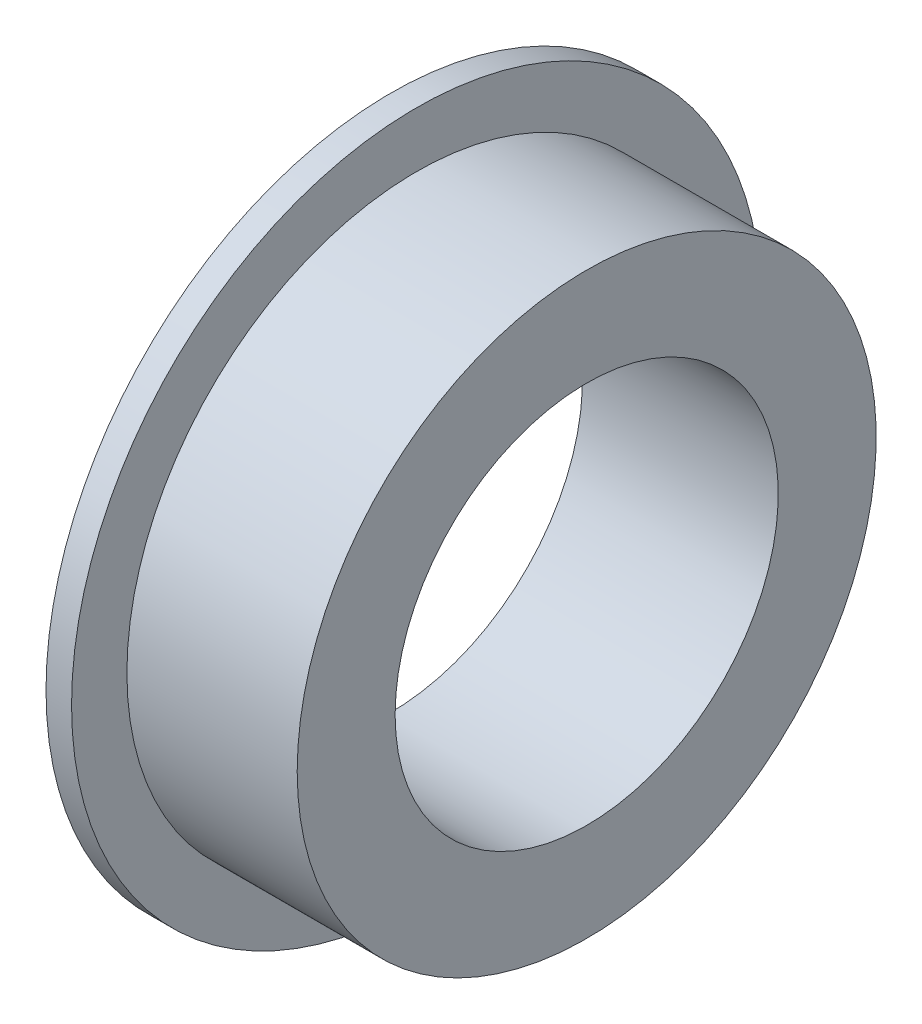
ISO-10303-21;
HEADER;
FILE_DESCRIPTION(('STEP AP214'),'2;1');
FILE_NAME('part.step','',(''),(''),'','','');
FILE_SCHEMA(('AUTOMOTIVE_DESIGN { 1 0 10303 214 1 1 1 1 }'));
ENDSEC;
DATA;
#1=APPLICATION_CONTEXT('core data for automotive mechanical design processes');
#2=APPLICATION_PROTOCOL_DEFINITION('international standard','automotive_design',2000,#1);
#3=PRODUCT_CONTEXT('',#1,'mechanical');
#4=PRODUCT('Part','Part','',(#3));
#5=PRODUCT_RELATED_PRODUCT_CATEGORY('part','',(#4));
#6=PRODUCT_DEFINITION_FORMATION('','',#4);
#7=PRODUCT_DEFINITION_CONTEXT('part definition',#1,'design');
#8=PRODUCT_DEFINITION('design','',#6,#7);
#9=PRODUCT_DEFINITION_SHAPE('','',#8);
#10=(LENGTH_UNIT() NAMED_UNIT(*) SI_UNIT(.MILLI.,.METRE.));
#11=(NAMED_UNIT(*) PLANE_ANGLE_UNIT() SI_UNIT($,.RADIAN.));
#12=(NAMED_UNIT(*) SI_UNIT($,.STERADIAN.) SOLID_ANGLE_UNIT());
#13=UNCERTAINTY_MEASURE_WITH_UNIT(LENGTH_MEASURE(1.E-05),#10,'distance_accuracy_value','');
#14=(GEOMETRIC_REPRESENTATION_CONTEXT(3) GLOBAL_UNCERTAINTY_ASSIGNED_CONTEXT((#13)) GLOBAL_UNIT_ASSIGNED_CONTEXT((#10,
#11,#12)) REPRESENTATION_CONTEXT('',''));
#15=CARTESIAN_POINT('',(0.,0.,0.));
#16=DIRECTION('',(0.,0.,1.));
#17=DIRECTION('',(1.,0.,0.));
#18=AXIS2_PLACEMENT_3D('',#15,#16,#17);
#19=CARTESIAN_POINT('',(0.,4.05,0.));
#20=DIRECTION('',(1.,0.,0.));
#21=DIRECTION('',(0.,0.,-1.));
#22=AXIS2_PLACEMENT_3D('',#19,#20,#21);
#23=PLANE('',#22);
#24=CARTESIAN_POINT('',(0.,0.,0.));
#25=DIRECTION('',(-1.,0.,0.));
#26=DIRECTION('',(0.,0.,1.));
#27=AXIS2_PLACEMENT_3D('',#24,#25,#26);
#28=CIRCLE('',#27,2.25);
#29=CARTESIAN_POINT('',(0.,0.,2.25));
#30=VERTEX_POINT('',#29);
#31=EDGE_CURVE('E64',#30,#30,#28,.T.);
#32=ORIENTED_EDGE('',*,*,#31,.F.);
#33=EDGE_LOOP('',(#32));
#34=FACE_BOUND('',#33,.T.);
#35=CARTESIAN_POINT('',(0.,0.,0.));
#36=DIRECTION('',(-1.,0.,0.));
#37=DIRECTION('',(0.,0.,1.));
#38=AXIS2_PLACEMENT_3D('',#35,#36,#37);
#39=CIRCLE('',#38,4.05);
#40=CARTESIAN_POINT('',(0.,0.,4.05));
#41=VERTEX_POINT('',#40);
#42=EDGE_CURVE('E10',#41,#41,#39,.T.);
#43=ORIENTED_EDGE('',*,*,#42,.T.);
#44=EDGE_LOOP('',(#43));
#45=FACE_BOUND('',#44,.T.);
#46=ADVANCED_FACE('F41',(#34,#45),#23,.F.);
#47=CARTESIAN_POINT('',(0.,0.,0.));
#48=DIRECTION('',(-1.,0.,0.));
#49=DIRECTION('',(0.,0.,1.));
#50=AXIS2_PLACEMENT_3D('',#47,#48,#49);
#51=CYLINDRICAL_SURFACE('',#50,4.05);
#52=ORIENTED_EDGE('',*,*,#42,.F.);
#53=EDGE_LOOP('',(#52));
#54=FACE_BOUND('',#53,.T.);
#55=CARTESIAN_POINT('',(0.3,0.,0.));
#56=DIRECTION('',(-1.,0.,0.));
#57=DIRECTION('',(0.,0.,1.));
#58=AXIS2_PLACEMENT_3D('',#55,#56,#57);
#59=CIRCLE('',#58,4.05);
#60=CARTESIAN_POINT('',(0.3,0.,4.05));
#61=VERTEX_POINT('',#60);
#62=EDGE_CURVE('E50',#61,#61,#59,.T.);
#63=ORIENTED_EDGE('',*,*,#62,.T.);
#64=EDGE_LOOP('',(#63));
#65=FACE_BOUND('',#64,.T.);
#66=ADVANCED_FACE('F68',(#54,#65),#51,.T.);
#67=CARTESIAN_POINT('',(0.3,4.05,0.));
#68=DIRECTION('',(-1.,0.,0.));
#69=DIRECTION('',(0.,0.,1.));
#70=AXIS2_PLACEMENT_3D('',#67,#68,#69);
#71=PLANE('',#70);
#72=ORIENTED_EDGE('',*,*,#62,.F.);
#73=EDGE_LOOP('',(#72));
#74=FACE_BOUND('',#73,.T.);
#75=CARTESIAN_POINT('',(0.3,0.,0.));
#76=DIRECTION('',(-1.,0.,0.));
#77=DIRECTION('',(0.,0.,1.));
#78=AXIS2_PLACEMENT_3D('',#75,#76,#77);
#79=CIRCLE('',#78,3.4);
#80=CARTESIAN_POINT('',(0.3,0.,3.4));
#81=VERTEX_POINT('',#80);
#82=EDGE_CURVE('E51',#81,#81,#79,.T.);
#83=ORIENTED_EDGE('',*,*,#82,.T.);
#84=EDGE_LOOP('',(#83));
#85=FACE_BOUND('',#84,.T.);
#86=ADVANCED_FACE('F73',(#74,#85),#71,.F.);
#87=CARTESIAN_POINT('',(0.,0.,0.));
#88=DIRECTION('',(-1.,0.,0.));
#89=DIRECTION('',(0.,0.,1.));
#90=AXIS2_PLACEMENT_3D('',#87,#88,#89);
#91=CYLINDRICAL_SURFACE('',#90,3.4);
#92=ORIENTED_EDGE('',*,*,#82,.F.);
#93=EDGE_LOOP('',(#92));
#94=FACE_BOUND('',#93,.T.);
#95=CARTESIAN_POINT('',(2.3,0.,0.));
#96=DIRECTION('',(-1.,0.,0.));
#97=DIRECTION('',(0.,0.,1.));
#98=AXIS2_PLACEMENT_3D('',#95,#96,#97);
#99=CIRCLE('',#98,3.4);
#100=CARTESIAN_POINT('',(2.3,0.,3.4));
#101=VERTEX_POINT('',#100);
#102=EDGE_CURVE('E54',#101,#101,#99,.T.);
#103=ORIENTED_EDGE('',*,*,#102,.T.);
#104=EDGE_LOOP('',(#103));
#105=FACE_BOUND('',#104,.T.);
#106=ADVANCED_FACE('F80',(#94,#105),#91,.T.);
#107=CARTESIAN_POINT('',(2.3,3.4,0.));
#108=DIRECTION('',(-1.,0.,0.));
#109=DIRECTION('',(0.,0.,1.));
#110=AXIS2_PLACEMENT_3D('',#107,#108,#109);
#111=PLANE('',#110);
#112=ORIENTED_EDGE('',*,*,#102,.F.);
#113=EDGE_LOOP('',(#112));
#114=FACE_BOUND('',#113,.T.);
#115=CARTESIAN_POINT('',(2.3,0.,0.));
#116=DIRECTION('',(-1.,0.,0.));
#117=DIRECTION('',(0.,0.,1.));
#118=AXIS2_PLACEMENT_3D('',#115,#116,#117);
#119=CIRCLE('',#118,2.25);
#120=CARTESIAN_POINT('',(2.3,0.,2.25));
#121=VERTEX_POINT('',#120);
#122=EDGE_CURVE('E58',#121,#121,#119,.T.);
#123=ORIENTED_EDGE('',*,*,#122,.T.);
#124=EDGE_LOOP('',(#123));
#125=FACE_BOUND('',#124,.T.);
#126=ADVANCED_FACE('F82',(#114,#125),#111,.F.);
#127=CARTESIAN_POINT('',(0.,0.,0.));
#128=DIRECTION('',(-1.,0.,0.));
#129=DIRECTION('',(0.,0.,1.));
#130=AXIS2_PLACEMENT_3D('',#127,#128,#129);
#131=CYLINDRICAL_SURFACE('',#130,2.25);
#132=ORIENTED_EDGE('',*,*,#122,.F.);
#133=EDGE_LOOP('',(#132));
#134=FACE_BOUND('',#133,.T.);
#135=ORIENTED_EDGE('',*,*,#31,.T.);
#136=EDGE_LOOP('',(#135));
#137=FACE_BOUND('',#136,.T.);
#138=ADVANCED_FACE('F70',(#134,#137),#131,.F.);
#139=CLOSED_SHELL('',(#46,#66,#86,#106,#126,#138));
#140=MANIFOLD_SOLID_BREP('B2',#139);
#141=ADVANCED_BREP_SHAPE_REPRESENTATION('',(#18,#140),#14);
#142=SHAPE_DEFINITION_REPRESENTATION(#9,#141);
ENDSEC;
END-ISO-10303-21;
